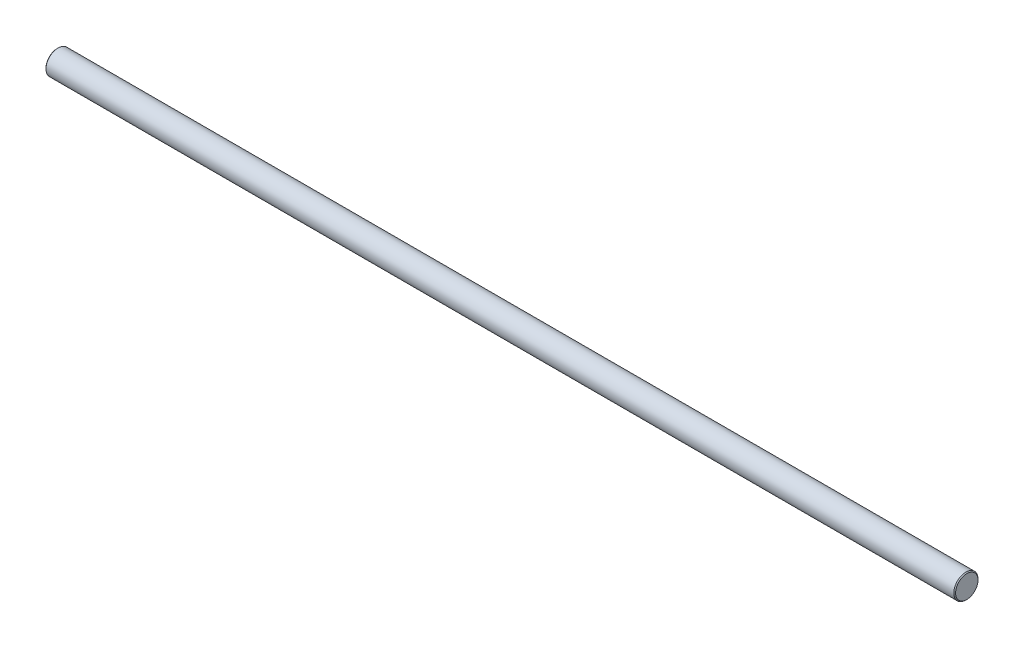
ISO-10303-21;
HEADER;
FILE_DESCRIPTION(('STEP AP214'),'2;1');
FILE_NAME('part.step','',(''),(''),'','','');
FILE_SCHEMA(('AUTOMOTIVE_DESIGN { 1 0 10303 214 1 1 1 1 }'));
ENDSEC;
DATA;
#1=APPLICATION_CONTEXT('core data for automotive mechanical design processes');
#2=APPLICATION_PROTOCOL_DEFINITION('international standard','automotive_design',2000,#1);
#3=PRODUCT_CONTEXT('',#1,'mechanical');
#4=PRODUCT('Part','Part','',(#3));
#5=PRODUCT_RELATED_PRODUCT_CATEGORY('part','',(#4));
#6=PRODUCT_DEFINITION_FORMATION('','',#4);
#7=PRODUCT_DEFINITION_CONTEXT('part definition',#1,'design');
#8=PRODUCT_DEFINITION('design','',#6,#7);
#9=PRODUCT_DEFINITION_SHAPE('','',#8);
#10=(LENGTH_UNIT() NAMED_UNIT(*) SI_UNIT(.MILLI.,.METRE.));
#11=(NAMED_UNIT(*) PLANE_ANGLE_UNIT() SI_UNIT($,.RADIAN.));
#12=(NAMED_UNIT(*) SI_UNIT($,.STERADIAN.) SOLID_ANGLE_UNIT());
#13=UNCERTAINTY_MEASURE_WITH_UNIT(LENGTH_MEASURE(1.E-05),#10,'distance_accuracy_value','');
#14=(GEOMETRIC_REPRESENTATION_CONTEXT(3) GLOBAL_UNCERTAINTY_ASSIGNED_CONTEXT((#13)) GLOBAL_UNIT_ASSIGNED_CONTEXT((#10,
#11,#12)) REPRESENTATION_CONTEXT('',''));
#15=CARTESIAN_POINT('',(0.,0.,0.));
#16=DIRECTION('',(0.,0.,1.));
#17=DIRECTION('',(1.,0.,0.));
#18=AXIS2_PLACEMENT_3D('',#15,#16,#17);
#19=CARTESIAN_POINT('',(0.,0.,0.));
#20=DIRECTION('',(1.,0.,0.));
#21=DIRECTION('',(0.,0.,-1.));
#22=AXIS2_PLACEMENT_3D('',#19,#20,#21);
#23=PLANE('',#22);
#24=CARTESIAN_POINT('',(0.,0.,0.));
#25=DIRECTION('',(1.,0.,0.));
#26=DIRECTION('',(0.,0.,-1.));
#27=AXIS2_PLACEMENT_3D('',#24,#25,#26);
#28=CIRCLE('',#27,3.69999999999998);
#29=CARTESIAN_POINT('',(0.,0.,-3.69999999999998));
#30=VERTEX_POINT('',#29);
#31=EDGE_CURVE('E10',#30,#30,#28,.F.);
#32=ORIENTED_EDGE('',*,*,#31,.T.);
#33=EDGE_LOOP('',(#32));
#34=FACE_BOUND('',#33,.T.);
#35=ADVANCED_FACE('F35',(#34),#23,.F.);
#36=CARTESIAN_POINT('',(0.,0.,0.));
#37=DIRECTION('',(-1.,0.,0.));
#38=DIRECTION('',(0.,0.,1.));
#39=AXIS2_PLACEMENT_3D('',#36,#37,#38);
#40=CYLINDRICAL_SURFACE('',#39,4.);
#41=CARTESIAN_POINT('',(299.7,0.,0.));
#42=DIRECTION('',(-1.,0.,0.));
#43=DIRECTION('',(0.,0.,1.));
#44=AXIS2_PLACEMENT_3D('',#41,#42,#43);
#45=CIRCLE('',#44,4.);
#46=CARTESIAN_POINT('',(299.7,0.,4.));
#47=VERTEX_POINT('',#46);
#48=EDGE_CURVE('E46',#47,#47,#45,.T.);
#49=ORIENTED_EDGE('',*,*,#48,.T.);
#50=EDGE_LOOP('',(#49));
#51=FACE_BOUND('',#50,.T.);
#52=CARTESIAN_POINT('',(0.300000000000028,0.,0.));
#53=DIRECTION('',(1.,0.,0.));
#54=DIRECTION('',(0.,0.,-1.));
#55=AXIS2_PLACEMENT_3D('',#52,#53,#54);
#56=CIRCLE('',#55,4.);
#57=CARTESIAN_POINT('',(0.300000000000028,0.,-4.));
#58=VERTEX_POINT('',#57);
#59=EDGE_CURVE('E50',#58,#58,#56,.T.);
#60=ORIENTED_EDGE('',*,*,#59,.T.);
#61=EDGE_LOOP('',(#60));
#62=FACE_BOUND('',#61,.T.);
#63=ADVANCED_FACE('F56',(#51,#62),#40,.T.);
#64=CARTESIAN_POINT('',(300.,0.,0.));
#65=DIRECTION('',(-1.,0.,0.));
#66=DIRECTION('',(0.,0.,1.));
#67=AXIS2_PLACEMENT_3D('',#64,#65,#66);
#68=PLANE('',#67);
#69=CARTESIAN_POINT('',(300.,0.,0.));
#70=DIRECTION('',(-1.,0.,0.));
#71=DIRECTION('',(0.,0.,1.));
#72=AXIS2_PLACEMENT_3D('',#69,#70,#71);
#73=CIRCLE('',#72,3.69999999999987);
#74=CARTESIAN_POINT('',(300.,0.,3.69999999999987));
#75=VERTEX_POINT('',#74);
#76=EDGE_CURVE('E42',#75,#75,#73,.F.);
#77=ORIENTED_EDGE('',*,*,#76,.T.);
#78=EDGE_LOOP('',(#77));
#79=FACE_BOUND('',#78,.T.);
#80=ADVANCED_FACE('F64',(#79),#68,.F.);
#81=CARTESIAN_POINT('',(299.7,0.,0.));
#82=DIRECTION('',(-1.,0.,0.));
#83=DIRECTION('',(0.,0.,1.));
#84=AXIS2_PLACEMENT_3D('',#81,#82,#83);
#85=CONICAL_SURFACE('',#84,4.,0.78539816339735);
#86=ORIENTED_EDGE('',*,*,#76,.F.);
#87=EDGE_LOOP('',(#86));
#88=FACE_BOUND('',#87,.T.);
#89=ORIENTED_EDGE('',*,*,#48,.F.);
#90=EDGE_LOOP('',(#89));
#91=FACE_BOUND('',#90,.T.);
#92=ADVANCED_FACE('F60',(#88,#91),#85,.T.);
#93=CARTESIAN_POINT('',(0.,0.,0.));
#94=DIRECTION('',(1.,0.,0.));
#95=DIRECTION('',(0.,0.,-1.));
#96=AXIS2_PLACEMENT_3D('',#93,#94,#95);
#97=CONICAL_SURFACE('',#96,3.69999999999998,0.785398163397434);
#98=CARTESIAN_POINT('',(0.300000000000028,0.,-4.));
#99=CARTESIAN_POINT('',(0.296875000000027,0.,-3.996875));
#100=CARTESIAN_POINT('',(0.293750000000027,0.,-3.99375));
#101=CARTESIAN_POINT('',(0.287500000000027,0.,-3.9875));
#102=CARTESIAN_POINT('',(0.284375000000026,0.,-3.984375));
#103=CARTESIAN_POINT('',(0.278125000000026,0.,-3.978125));
#104=CARTESIAN_POINT('',(0.275000000000026,0.,-3.975));
#105=CARTESIAN_POINT('',(0.268750000000025,0.,-3.96875));
#106=CARTESIAN_POINT('',(0.265625000000025,0.,-3.965625));
#107=CARTESIAN_POINT('',(0.259375000000024,0.,-3.959375));
#108=CARTESIAN_POINT('',(0.256250000000024,0.,-3.95625));
#109=CARTESIAN_POINT('',(0.250000000000023,0.,-3.95));
#110=CARTESIAN_POINT('',(0.246875000000023,0.,-3.946875));
#111=CARTESIAN_POINT('',(0.240625000000022,0.,-3.940625));
#112=CARTESIAN_POINT('',(0.237500000000022,0.,-3.9375));
#113=CARTESIAN_POINT('',(0.231250000000021,0.,-3.93125));
#114=CARTESIAN_POINT('',(0.228125000000021,0.,-3.928125));
#115=CARTESIAN_POINT('',(0.221875000000021,0.,-3.92187499999999));
#116=CARTESIAN_POINT('',(0.21875000000002,0.,-3.91875));
#117=CARTESIAN_POINT('',(0.21250000000002,0.,-3.91249999999999));
#118=CARTESIAN_POINT('',(0.209375000000019,0.,-3.90937499999999));
#119=CARTESIAN_POINT('',(0.203125000000019,0.,-3.90312499999999));
#120=CARTESIAN_POINT('',(0.200000000000018,0.,-3.89999999999999));
#121=CARTESIAN_POINT('',(0.193750000000018,0.,-3.89374999999999));
#122=CARTESIAN_POINT('',(0.190625000000018,0.,-3.89062499999999));
#123=CARTESIAN_POINT('',(0.184375000000017,0.,-3.88437499999999));
#124=CARTESIAN_POINT('',(0.181250000000017,0.,-3.88124999999999));
#125=CARTESIAN_POINT('',(0.175000000000016,0.,-3.87499999999999));
#126=CARTESIAN_POINT('',(0.171875000000016,0.,-3.87187499999999));
#127=CARTESIAN_POINT('',(0.165625000000015,0.,-3.86562499999999));
#128=CARTESIAN_POINT('',(0.162500000000015,0.,-3.86249999999999));
#129=CARTESIAN_POINT('',(0.156250000000014,0.,-3.85624999999999));
#130=CARTESIAN_POINT('',(0.153125000000014,0.,-3.85312499999999));
#131=CARTESIAN_POINT('',(0.146875000000014,0.,-3.84687499999999));
#132=CARTESIAN_POINT('',(0.143750000000013,0.,-3.84374999999999));
#133=CARTESIAN_POINT('',(0.137500000000013,0.,-3.83749999999999));
#134=CARTESIAN_POINT('',(0.134375000000012,0.,-3.83437499999999));
#135=CARTESIAN_POINT('',(0.128125000000012,0.,-3.82812499999999));
#136=CARTESIAN_POINT('',(0.125000000000012,0.,-3.82499999999999));
#137=CARTESIAN_POINT('',(0.118750000000011,0.,-3.81874999999999));
#138=CARTESIAN_POINT('',(0.115625000000011,0.,-3.81562499999999));
#139=CARTESIAN_POINT('',(0.10937500000001,0.,-3.80937499999999));
#140=CARTESIAN_POINT('',(0.10625000000001,0.,-3.80624999999999));
#141=CARTESIAN_POINT('',(0.100000000000009,0.,-3.79999999999999));
#142=CARTESIAN_POINT('',(0.0968750000000089,0.,-3.79687499999999));
#143=CARTESIAN_POINT('',(0.0906250000000083,0.,-3.79062499999999));
#144=CARTESIAN_POINT('',(0.0875000000000081,0.,-3.78749999999999));
#145=CARTESIAN_POINT('',(0.0812500000000075,0.,-3.78124999999999));
#146=CARTESIAN_POINT('',(0.0781250000000072,0.,-3.77812499999999));
#147=CARTESIAN_POINT('',(0.0718750000000067,0.,-3.77187499999999));
#148=CARTESIAN_POINT('',(0.0687500000000064,0.,-3.76874999999999));
#149=CARTESIAN_POINT('',(0.0625000000000058,0.,-3.76249999999999));
#150=CARTESIAN_POINT('',(0.0593750000000055,0.,-3.75937499999998));
#151=CARTESIAN_POINT('',(0.0531250000000049,0.,-3.75312499999998));
#152=CARTESIAN_POINT('',(0.0500000000000046,0.,-3.74999999999998));
#153=CARTESIAN_POINT('',(0.043750000000004,0.,-3.74374999999998));
#154=CARTESIAN_POINT('',(0.0406250000000037,0.,-3.74062499999998));
#155=CARTESIAN_POINT('',(0.0343750000000032,0.,-3.73437499999998));
#156=CARTESIAN_POINT('',(0.0312500000000029,0.,-3.73124999999998));
#157=CARTESIAN_POINT('',(0.0250000000000023,0.,-3.72499999999998));
#158=CARTESIAN_POINT('',(0.021875000000002,0.,-3.72187499999998));
#159=CARTESIAN_POINT('',(0.0156250000000014,0.,-3.71562499999998));
#160=CARTESIAN_POINT('',(0.0125000000000011,0.,-3.71249999999998));
#161=CARTESIAN_POINT('',(0.0062500000000006,0.,-3.70624999999998));
#162=CARTESIAN_POINT('',(0.00312500000000034,0.,-3.70312499999998));
#163=CARTESIAN_POINT('',(0.,0.,-3.69999999999998));
#164=B_SPLINE_CURVE_WITH_KNOTS('',3,(#98,#99,#100,#101,#102,#103,#104,#105,#106,#107,#108,#109,
#110,#111,#112,#113,#114,#115,#116,#117,#118,#119,#120,#121,#122,#123,#124,#125,#126,#127,#128,
#129,#130,#131,#132,#133,#134,#135,#136,#137,#138,#139,#140,#141,#142,#143,#144,#145,#146,#147,
#148,#149,#150,#151,#152,#153,#154,#155,#156,#157,#158,#159,#160,#161,#162,#163),.UNSPECIFIED.,
.F.,.F.,(4,2,2,2,2,2,2,2,2,2,2,2,2,2,2,2,2,2,2,2,2,2,2,2,2,2,2,2,2,2,2,2,4),(0.,
0.0132582521472489,0.0265165042944977,0.0397747564417466,0.0530330085889949,0.0662912607362438,
0.0795495128834926,0.0928077650307415,0.10606601717799,0.119324269325239,0.132582521472488,
0.145840773619737,0.159099025766986,0.172357277914234,0.185615530061483,0.198873782208732,
0.212132034355981,0.22539028650323,0.238648538650478,0.251906790797727,0.265165042944976,
0.278423295092225,0.291681547239473,0.304939799386722,0.318198051533971,0.33145630368122,
0.344714555828468,0.357972807975717,0.371231060122966,0.384489312270215,0.397747564417464,
0.411005816564712,0.424264068711961),.UNSPECIFIED.);
#165=EDGE_CURVE('BSEAM37',#58,#30,#164,.T.);
#166=ORIENTED_EDGE('',*,*,#59,.F.);
#167=ORIENTED_EDGE('',*,*,#31,.F.);
#168=ORIENTED_EDGE('',*,*,#165,.T.);
#169=ORIENTED_EDGE('',*,*,#165,.F.);
#170=EDGE_LOOP('',(#166,#168,#167,#169));
#171=FACE_BOUND('',#170,.T.);
#172=ADVANCED_FACE('F37',(#171),#97,.T.);
#173=CLOSED_SHELL('',(#35,#63,#80,#92,#172));
#174=MANIFOLD_SOLID_BREP('B2',#173);
#175=ADVANCED_BREP_SHAPE_REPRESENTATION('',(#18,#174),#14);
#176=SHAPE_DEFINITION_REPRESENTATION(#9,#175);
ENDSEC;
END-ISO-10303-21;
